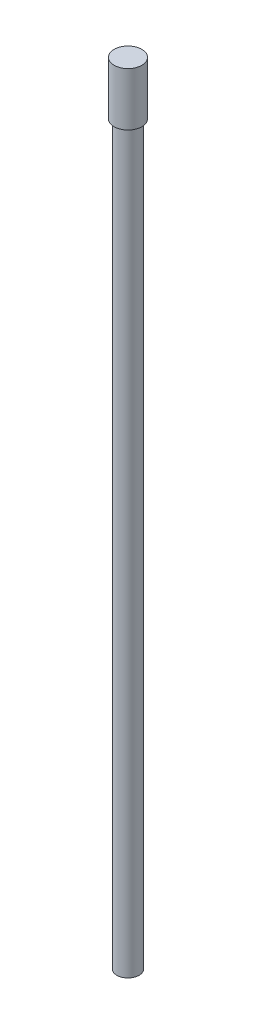
ISO-10303-21;
HEADER;
FILE_DESCRIPTION(('STEP AP214'),'2;1');
FILE_NAME('part.step','',(''),(''),'','','');
FILE_SCHEMA(('AUTOMOTIVE_DESIGN { 1 0 10303 214 1 1 1 1 }'));
ENDSEC;
DATA;
#1=APPLICATION_CONTEXT('core data for automotive mechanical design processes');
#2=APPLICATION_PROTOCOL_DEFINITION('international standard','automotive_design',2000,#1);
#3=PRODUCT_CONTEXT('',#1,'mechanical');
#4=PRODUCT('Part','Part','',(#3));
#5=PRODUCT_RELATED_PRODUCT_CATEGORY('part','',(#4));
#6=PRODUCT_DEFINITION_FORMATION('','',#4);
#7=PRODUCT_DEFINITION_CONTEXT('part definition',#1,'design');
#8=PRODUCT_DEFINITION('design','',#6,#7);
#9=PRODUCT_DEFINITION_SHAPE('','',#8);
#10=(LENGTH_UNIT() NAMED_UNIT(*) SI_UNIT(.MILLI.,.METRE.));
#11=(NAMED_UNIT(*) PLANE_ANGLE_UNIT() SI_UNIT($,.RADIAN.));
#12=(NAMED_UNIT(*) SI_UNIT($,.STERADIAN.) SOLID_ANGLE_UNIT());
#13=UNCERTAINTY_MEASURE_WITH_UNIT(LENGTH_MEASURE(1.E-05),#10,'distance_accuracy_value','');
#14=(GEOMETRIC_REPRESENTATION_CONTEXT(3) GLOBAL_UNCERTAINTY_ASSIGNED_CONTEXT((#13)) GLOBAL_UNIT_ASSIGNED_CONTEXT((#10,
#11,#12)) REPRESENTATION_CONTEXT('',''));
#15=CARTESIAN_POINT('',(0.,0.,0.));
#16=DIRECTION('',(0.,0.,1.));
#17=DIRECTION('',(1.,0.,0.));
#18=AXIS2_PLACEMENT_3D('',#15,#16,#17);
#19=CARTESIAN_POINT('',(0.,362.06,0.));
#20=DIRECTION('',(0.,-1.,0.));
#21=DIRECTION('',(0.,0.,-1.));
#22=AXIS2_PLACEMENT_3D('',#19,#20,#21);
#23=CYLINDRICAL_SURFACE('',#22,5.1);
#24=CARTESIAN_POINT('',(0.,0.,0.));
#25=DIRECTION('',(0.,1.,0.));
#26=DIRECTION('',(0.,0.,1.));
#27=AXIS2_PLACEMENT_3D('',#24,#25,#26);
#28=CIRCLE('',#27,5.1);
#29=CARTESIAN_POINT('',(0.,0.,5.1));
#30=VERTEX_POINT('',#29);
#31=EDGE_CURVE('E43',#30,#30,#28,.T.);
#32=ORIENTED_EDGE('',*,*,#31,.T.);
#33=EDGE_LOOP('',(#32));
#34=FACE_BOUND('',#33,.T.);
#35=CARTESIAN_POINT('',(0.,337.66,0.));
#36=DIRECTION('',(0.,1.,0.));
#37=DIRECTION('',(0.,0.,1.));
#38=AXIS2_PLACEMENT_3D('',#35,#36,#37);
#39=CIRCLE('',#38,5.1);
#40=CARTESIAN_POINT('',(0.,337.66,5.1));
#41=VERTEX_POINT('',#40);
#42=EDGE_CURVE('E10',#41,#41,#39,.T.);
#43=ORIENTED_EDGE('',*,*,#42,.F.);
#44=EDGE_LOOP('',(#43));
#45=FACE_BOUND('',#44,.T.);
#46=ADVANCED_FACE('F37',(#34,#45),#23,.T.);
#47=CARTESIAN_POINT('',(0.,0.,0.));
#48=DIRECTION('',(0.,1.,0.));
#49=DIRECTION('',(0.,0.,1.));
#50=AXIS2_PLACEMENT_3D('',#47,#48,#49);
#51=PLANE('',#50);
#52=ORIENTED_EDGE('',*,*,#31,.F.);
#53=EDGE_LOOP('',(#52));
#54=FACE_BOUND('',#53,.T.);
#55=ADVANCED_FACE('F62',(#54),#51,.F.);
#56=CARTESIAN_POINT('',(0.,337.66,0.));
#57=DIRECTION('',(0.,1.,0.));
#58=DIRECTION('',(0.,0.,1.));
#59=AXIS2_PLACEMENT_3D('',#56,#57,#58);
#60=CYLINDRICAL_SURFACE('',#59,6.35);
#61=CARTESIAN_POINT('',(0.,337.66,0.));
#62=DIRECTION('',(0.,1.,0.));
#63=DIRECTION('',(0.,0.,1.));
#64=AXIS2_PLACEMENT_3D('',#61,#62,#63);
#65=CIRCLE('',#64,6.35);
#66=CARTESIAN_POINT('',(0.,337.66,6.35));
#67=VERTEX_POINT('',#66);
#68=EDGE_CURVE('E47',#67,#67,#65,.T.);
#69=ORIENTED_EDGE('',*,*,#68,.T.);
#70=EDGE_LOOP('',(#69));
#71=FACE_BOUND('',#70,.T.);
#72=CARTESIAN_POINT('',(0.,362.06,0.));
#73=DIRECTION('',(0.,1.,0.));
#74=DIRECTION('',(0.,0.,1.));
#75=AXIS2_PLACEMENT_3D('',#72,#73,#74);
#76=CIRCLE('',#75,6.35);
#77=CARTESIAN_POINT('',(0.,362.06,6.35));
#78=VERTEX_POINT('',#77);
#79=EDGE_CURVE('E51',#78,#78,#76,.T.);
#80=ORIENTED_EDGE('',*,*,#79,.F.);
#81=EDGE_LOOP('',(#80));
#82=FACE_BOUND('',#81,.T.);
#83=ADVANCED_FACE('F59',(#71,#82),#60,.T.);
#84=CARTESIAN_POINT('',(0.,337.66,0.));
#85=DIRECTION('',(0.,1.,0.));
#86=DIRECTION('',(0.,0.,1.));
#87=AXIS2_PLACEMENT_3D('',#84,#85,#86);
#88=PLANE('',#87);
#89=ORIENTED_EDGE('',*,*,#42,.T.);
#90=EDGE_LOOP('',(#89));
#91=FACE_BOUND('',#90,.T.);
#92=ORIENTED_EDGE('',*,*,#68,.F.);
#93=EDGE_LOOP('',(#92));
#94=FACE_BOUND('',#93,.T.);
#95=ADVANCED_FACE('F61',(#91,#94),#88,.F.);
#96=CARTESIAN_POINT('',(0.,362.06,0.));
#97=DIRECTION('',(0.,1.,0.));
#98=DIRECTION('',(0.,0.,1.));
#99=AXIS2_PLACEMENT_3D('',#96,#97,#98);
#100=PLANE('',#99);
#101=ORIENTED_EDGE('',*,*,#79,.T.);
#102=EDGE_LOOP('',(#101));
#103=FACE_BOUND('',#102,.T.);
#104=ADVANCED_FACE('F57',(#103),#100,.T.);
#105=CLOSED_SHELL('',(#46,#55,#83,#95,#104));
#106=MANIFOLD_SOLID_BREP('B2',#105);
#107=ADVANCED_BREP_SHAPE_REPRESENTATION('',(#18,#106),#14);
#108=SHAPE_DEFINITION_REPRESENTATION(#9,#107);
ENDSEC;
END-ISO-10303-21;
